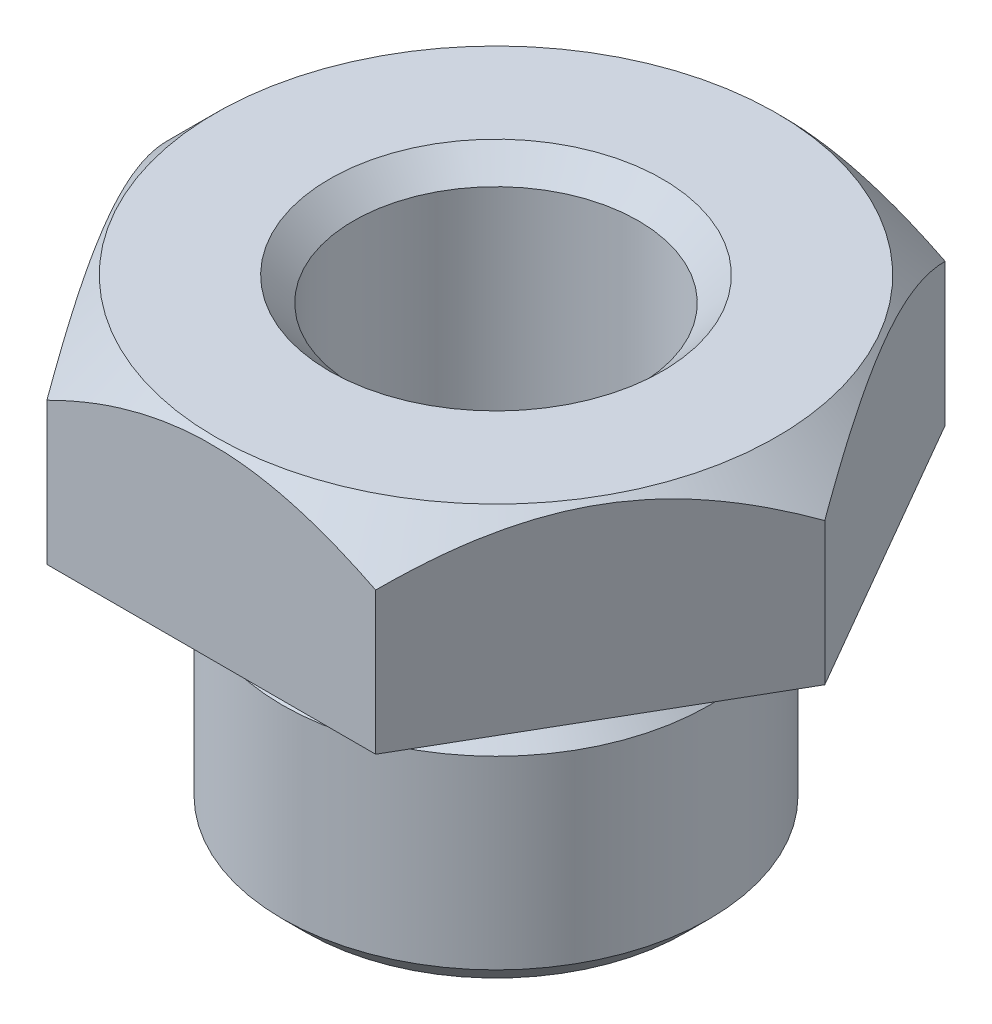
ISO-10303-21;
HEADER;
FILE_DESCRIPTION(('STEP AP214'),'2;1');
FILE_NAME('part.step','',(''),(''),'','','');
FILE_SCHEMA(('AUTOMOTIVE_DESIGN { 1 0 10303 214 1 1 1 1 }'));
ENDSEC;
DATA;
#1=APPLICATION_CONTEXT('core data for automotive mechanical design processes');
#2=APPLICATION_PROTOCOL_DEFINITION('international standard','automotive_design',2000,#1);
#3=PRODUCT_CONTEXT('',#1,'mechanical');
#4=PRODUCT('Part','Part','',(#3));
#5=PRODUCT_RELATED_PRODUCT_CATEGORY('part','',(#4));
#6=PRODUCT_DEFINITION_FORMATION('','',#4);
#7=PRODUCT_DEFINITION_CONTEXT('part definition',#1,'design');
#8=PRODUCT_DEFINITION('design','',#6,#7);
#9=PRODUCT_DEFINITION_SHAPE('','',#8);
#10=(LENGTH_UNIT() NAMED_UNIT(*) SI_UNIT(.MILLI.,.METRE.));
#11=(NAMED_UNIT(*) PLANE_ANGLE_UNIT() SI_UNIT($,.RADIAN.));
#12=(NAMED_UNIT(*) SI_UNIT($,.STERADIAN.) SOLID_ANGLE_UNIT());
#13=UNCERTAINTY_MEASURE_WITH_UNIT(LENGTH_MEASURE(1.E-05),#10,'distance_accuracy_value','');
#14=(GEOMETRIC_REPRESENTATION_CONTEXT(3) GLOBAL_UNCERTAINTY_ASSIGNED_CONTEXT((#13)) GLOBAL_UNIT_ASSIGNED_CONTEXT((#10,
#11,#12)) REPRESENTATION_CONTEXT('',''));
#15=CARTESIAN_POINT('',(0.,0.,0.));
#16=DIRECTION('',(0.,0.,1.));
#17=DIRECTION('',(1.,0.,0.));
#18=AXIS2_PLACEMENT_3D('',#15,#16,#17);
#19=CARTESIAN_POINT('',(0.,0.4953,0.));
#20=DIRECTION('',(0.,-1.,0.));
#21=DIRECTION('',(0.,0.,-1.));
#22=AXIS2_PLACEMENT_3D('',#19,#20,#21);
#23=CYLINDRICAL_SURFACE('',#22,2.25);
#24=CARTESIAN_POINT('',(0.,-2.2479,0.));
#25=DIRECTION('',(0.,1.,0.));
#26=DIRECTION('',(0.,0.,1.));
#27=AXIS2_PLACEMENT_3D('',#24,#25,#26);
#28=CIRCLE('',#27,2.25);
#29=CARTESIAN_POINT('',(0.,-2.2479,2.25));
#30=VERTEX_POINT('',#29);
#31=EDGE_CURVE('E11',#30,#30,#28,.T.);
#32=ORIENTED_EDGE('',*,*,#31,.T.);
#33=EDGE_LOOP('',(#32));
#34=FACE_BOUND('',#33,.T.);
#35=CARTESIAN_POINT('',(0.,-0.29845,0.));
#36=DIRECTION('',(0.,1.,0.));
#37=DIRECTION('',(0.,0.,1.));
#38=AXIS2_PLACEMENT_3D('',#35,#36,#37);
#39=CIRCLE('',#38,2.25);
#40=CARTESIAN_POINT('',(0.,-0.29845,2.25));
#41=VERTEX_POINT('',#40);
#42=EDGE_CURVE('E252',#41,#41,#39,.T.);
#43=ORIENTED_EDGE('',*,*,#42,.F.);
#44=EDGE_LOOP('',(#43));
#45=FACE_BOUND('',#44,.T.);
#46=ADVANCED_FACE('F17',(#34,#45),#23,.T.);
#47=CARTESIAN_POINT('',(-1.73205080756888,2.5019,-3.));
#48=DIRECTION('',(0.866025403784439,0.,0.5));
#49=DIRECTION('',(0.5,0.,-0.866025403784439));
#50=AXIS2_PLACEMENT_3D('',#47,#48,#49);
#51=PLANE('',#50);
#52=CARTESIAN_POINT('',(-1.73193533751504,1.99378452417285,-3.0002));
#53=CARTESIAN_POINT('',(-1.79147372663452,2.05327168167821,-2.89707648504425));
#54=CARTESIAN_POINT('',(-1.85200767512883,2.10926502053448,-2.79222861066935));
#55=CARTESIAN_POINT('',(-1.97544301635334,2.21178740362106,-2.57843232821891));
#56=CARTESIAN_POINT('',(-2.03835614749388,2.25825940625871,-2.46946358862024));
#57=CARTESIAN_POINT('',(-2.16521745390422,2.3378668114837,-2.24973336040297));
#58=CARTESIAN_POINT('',(-2.22913332270057,2.37120229935733,-2.13902782823779));
#59=CARTESIAN_POINT('',(-2.35837216363117,2.4225624560207,-1.91517958943468));
#60=CARTESIAN_POINT('',(-2.42369118784644,2.4406254624644,-1.80204372079301));
#61=CARTESIAN_POINT('',(-2.53626564359199,2.4569230915495,-1.6070590438073));
#62=CARTESIAN_POINT('',(-2.58337569224233,2.45933563282619,-1.52546204599787));
#63=CARTESIAN_POINT('',(-2.67751916315865,2.45527056534289,-1.36240077116991));
#64=CARTESIAN_POINT('',(-2.72455255277569,2.4487898399717,-1.28093655070102));
#65=CARTESIAN_POINT('',(-2.81817374583237,2.42730827748478,-1.11877988766164));
#66=CARTESIAN_POINT('',(-2.86476099147974,2.41229791003272,-1.0380884112157));
#67=CARTESIAN_POINT('',(-2.95713536549224,2.37457635393399,-0.878091302108671));
#68=CARTESIAN_POINT('',(-3.00292255491614,2.35186575567717,-0.798785563690711));
#69=CARTESIAN_POINT('',(-3.0842086834051,2.30513931514606,-0.657993859197254));
#70=CARTESIAN_POINT('',(-3.11988753362891,2.28235167231921,-0.596196277853981));
#71=CARTESIAN_POINT('',(-3.19060468282508,2.23310371394256,-0.473710582479786));
#72=CARTESIAN_POINT('',(-3.22564296221629,2.20664328633381,-0.413022502364402));
#73=CARTESIAN_POINT('',(-3.29496858432307,2.15064300560864,-0.292947002609142));
#74=CARTESIAN_POINT('',(-3.3292578988429,2.12111283552163,-0.233556167704086));
#75=CARTESIAN_POINT('',(-3.39720147685868,2.05936090842448,-0.115874438532735));
#76=CARTESIAN_POINT('',(-3.43085611477446,2.02714080334065,-0.0575828957522686));
#77=CARTESIAN_POINT('',(-3.46421708519159,1.99378452417285,0.000199999999997666));
#78=B_SPLINE_CURVE_WITH_KNOTS('',3,(#52,#53,#54,#55,#56,#57,#58,#59,#60,#61,#62,#63,#64,#65,#66,
#67,#68,#69,#70,#71,#72,#73,#74,#75,#76,#77),.UNSPECIFIED.,.F.,.F.,(4,2,2,2,2,2,2,2,2,2,2,2,4),
(0.,0.399603557139305,0.801535286397844,1.19708369162343,1.59163620080173,1.87398941755844,
2.15644160919092,2.43921001247425,2.72195674032137,2.94657516661926,3.17120044767274,
3.3951375283781,3.61893808380739),.UNSPECIFIED.);
#79=CARTESIAN_POINT('',(-1.73205080756888,1.9939,-3.));
#80=VERTEX_POINT('',#79);
#81=CARTESIAN_POINT('',(-3.46410161513776,1.9939,0.));
#82=VERTEX_POINT('',#81);
#83=EDGE_CURVE('E208',#80,#82,#78,.T.);
#84=ORIENTED_EDGE('',*,*,#83,.F.);
#85=DIRECTION('',(0.,-1.,0.));
#86=VECTOR('',#85,1.);
#87=CARTESIAN_POINT('',(-1.73205080756888,2.5019,-3.));
#88=LINE('',#87,#86);
#89=CARTESIAN_POINT('',(-1.73205080756888,0.4953,-3.));
#90=VERTEX_POINT('',#89);
#91=EDGE_CURVE('E40',#80,#90,#88,.T.);
#92=ORIENTED_EDGE('',*,*,#91,.T.);
#93=DIRECTION('',(0.5,0.,-0.866025403784439));
#94=VECTOR('',#93,1.);
#95=CARTESIAN_POINT('',(-1.73205080756888,0.4953,-3.));
#96=LINE('',#95,#94);
#97=CARTESIAN_POINT('',(-3.46410161513775,0.4953,0.));
#98=VERTEX_POINT('',#97);
#99=EDGE_CURVE('E233',#98,#90,#96,.T.);
#100=ORIENTED_EDGE('',*,*,#99,.F.);
#101=DIRECTION('',(0.,-1.,0.));
#102=VECTOR('',#101,1.);
#103=CARTESIAN_POINT('',(-3.46410161513775,2.5019,0.));
#104=LINE('',#103,#102);
#105=EDGE_CURVE('E94',#82,#98,#104,.T.);
#106=ORIENTED_EDGE('',*,*,#105,.F.);
#107=EDGE_LOOP('',(#84,#92,#100,#106));
#108=FACE_BOUND('',#107,.T.);
#109=ADVANCED_FACE('F143',(#108),#51,.F.);
#110=CARTESIAN_POINT('',(-3.46410161513775,2.5019,0.));
#111=DIRECTION('',(0.866025403784439,0.,-0.5));
#112=DIRECTION('',(-0.5,0.,-0.866025403784439));
#113=AXIS2_PLACEMENT_3D('',#110,#111,#112);
#114=PLANE('',#113);
#115=CARTESIAN_POINT('',(-3.46421708519159,1.99378452417285,-0.000200000000002596));
#116=CARTESIAN_POINT('',(-3.40467869607211,2.05327168167822,0.102923514955745));
#117=CARTESIAN_POINT('',(-3.3441447475778,2.10926502053448,0.207771389330647));
#118=CARTESIAN_POINT('',(-3.2207094063533,2.21178740362106,0.421567671781092));
#119=CARTESIAN_POINT('',(-3.15779627521275,2.25825940625871,0.530536411379756));
#120=CARTESIAN_POINT('',(-3.03093496880242,2.3378668114837,0.750266639597024));
#121=CARTESIAN_POINT('',(-2.96701910000607,2.37120229935733,0.860972171762207));
#122=CARTESIAN_POINT('',(-2.83778025907547,2.4225624560207,1.08482041056532));
#123=CARTESIAN_POINT('',(-2.7724612348602,2.4406254624644,1.19795627920699));
#124=CARTESIAN_POINT('',(-2.65988677911465,2.45692309154951,1.3929409561927));
#125=CARTESIAN_POINT('',(-2.6127767304643,2.4593356328262,1.47453795400213));
#126=CARTESIAN_POINT('',(-2.51863325954798,2.45527056534289,1.63759922883008));
#127=CARTESIAN_POINT('',(-2.47159986993094,2.4487898399717,1.71906344929898));
#128=CARTESIAN_POINT('',(-2.37797867687426,2.42730827748478,1.88122011233836));
#129=CARTESIAN_POINT('',(-2.3313914312269,2.41229791003273,1.96191158878429));
#130=CARTESIAN_POINT('',(-2.23901705721439,2.37457635393399,2.12190869789133));
#131=CARTESIAN_POINT('',(-2.1932298677905,2.35186575567717,2.20121443630929));
#132=CARTESIAN_POINT('',(-2.11194373930153,2.30513931514606,2.34200614080275));
#133=CARTESIAN_POINT('',(-2.07626488907773,2.28235167231921,2.40380372214602));
#134=CARTESIAN_POINT('',(-2.00554773988156,2.23310371394256,2.52628941752021));
#135=CARTESIAN_POINT('',(-1.97050946049034,2.20664328633381,2.5869774976356));
#136=CARTESIAN_POINT('',(-1.90118383838356,2.15064300560864,2.70705299739086));
#137=CARTESIAN_POINT('',(-1.86689452386373,2.12111283552163,2.76644383229592));
#138=CARTESIAN_POINT('',(-1.79895094584795,2.05936090842448,2.88412556146727));
#139=CARTESIAN_POINT('',(-1.76529630793217,2.02714080334065,2.94241710424773));
#140=CARTESIAN_POINT('',(-1.73193533751504,1.99378452417285,3.0002));
#141=B_SPLINE_CURVE_WITH_KNOTS('',3,(#115,#116,#117,#118,#119,#120,#121,#122,#123,#124,#125,
#126,#127,#128,#129,#130,#131,#132,#133,#134,#135,#136,#137,#138,#139,#140),.UNSPECIFIED.,.F.,
.F.,(4,2,2,2,2,2,2,2,2,2,2,2,4),(0.,0.399603557139306,0.801535286397844,1.19708369162343,
1.59163620080173,1.87398941755844,2.15644160919092,2.43921001247424,2.72195674032137,
2.94657516661926,3.17120044767274,3.3951375283781,3.61893808380739),.UNSPECIFIED.);
#142=CARTESIAN_POINT('',(-1.73205080756888,1.9939,3.));
#143=VERTEX_POINT('',#142);
#144=EDGE_CURVE('E75',#82,#143,#141,.T.);
#145=ORIENTED_EDGE('',*,*,#144,.F.);
#146=ORIENTED_EDGE('',*,*,#105,.T.);
#147=DIRECTION('',(-0.5,0.,-0.866025403784439));
#148=VECTOR('',#147,1.);
#149=CARTESIAN_POINT('',(-3.46410161513775,0.4953,0.));
#150=LINE('',#149,#148);
#151=CARTESIAN_POINT('',(-1.73205080756888,0.4953,3.));
#152=VERTEX_POINT('',#151);
#153=EDGE_CURVE('E237',#152,#98,#150,.T.);
#154=ORIENTED_EDGE('',*,*,#153,.F.);
#155=DIRECTION('',(0.,-1.,0.));
#156=VECTOR('',#155,1.);
#157=CARTESIAN_POINT('',(-1.73205080756888,2.5019,3.));
#158=LINE('',#157,#156);
#159=EDGE_CURVE('E92',#143,#152,#158,.T.);
#160=ORIENTED_EDGE('',*,*,#159,.F.);
#161=EDGE_LOOP('',(#145,#146,#154,#160));
#162=FACE_BOUND('',#161,.T.);
#163=ADVANCED_FACE('F148',(#162),#114,.F.);
#164=CARTESIAN_POINT('',(-1.73205080756888,2.5019,3.));
#165=DIRECTION('',(0.,0.,-1.));
#166=DIRECTION('',(-1.,0.,0.));
#167=AXIS2_PLACEMENT_3D('',#164,#165,#166);
#168=PLANE('',#167);
#169=CARTESIAN_POINT('',(-3.59695086276358,0.774193814946156,3.));
#170=CARTESIAN_POINT('',(-3.50998157030183,0.84096724693537,3.));
#171=CARTESIAN_POINT('',(-3.42254166577498,0.907137397886244,3.));
#172=CARTESIAN_POINT('',(-3.24652900024599,1.03799611293745,3.));
#173=CARTESIAN_POINT('',(-3.15795597444398,1.10268432048757,3.));
#174=CARTESIAN_POINT('',(-2.97883797786402,1.2307645173772,3.));
#175=CARTESIAN_POINT('',(-2.88828306265059,1.29414264524063,3.));
#176=CARTESIAN_POINT('',(-2.70566270010348,1.41867649616719,3.));
#177=CARTESIAN_POINT('',(-2.61359735768501,1.47983237264857,3.));
#178=CARTESIAN_POINT('',(-2.4218744779485,1.60316656395522,3.));
#179=CARTESIAN_POINT('',(-2.32210289356472,1.6651684834916,3.));
#180=CARTESIAN_POINT('',(-2.12021794189516,1.78529964178567,3.));
#181=CARTESIAN_POINT('',(-2.01810418683339,1.84342823295221,3.));
#182=CARTESIAN_POINT('',(-1.81151102958675,1.95457298531259,3.));
#183=CARTESIAN_POINT('',(-1.70703976758902,2.00760415894041,3.));
#184=CARTESIAN_POINT('',(-1.49515494056828,2.10736599217492,3.));
#185=CARTESIAN_POINT('',(-1.38774278636662,2.15409961130161,3.));
#186=CARTESIAN_POINT('',(-1.18029844183721,2.23543902777672,3.));
#187=CARTESIAN_POINT('',(-1.08055778348695,2.27078076314877,3.));
#188=CARTESIAN_POINT('',(-0.878550486228742,2.33347903086965,3.));
#189=CARTESIAN_POINT('',(-0.776283685576635,2.36083505046315,3.));
#190=CARTESIAN_POINT('',(-0.571606980836931,2.40563119534322,3.));
#191=CARTESIAN_POINT('',(-0.469236911942401,2.42325028248963,3.));
#192=CARTESIAN_POINT('',(-0.263244203517824,2.44820759032046,3.));
#193=CARTESIAN_POINT('',(-0.15962182297908,2.45554790127102,3.));
#194=CARTESIAN_POINT('',(0.0433812195169501,2.4593310610849,3.));
#195=CARTESIAN_POINT('',(0.142753528363383,2.45622705036072,3.));
#196=CARTESIAN_POINT('',(0.340714729188156,2.44032923231905,3.));
#197=CARTESIAN_POINT('',(0.43930354858696,2.42753453762644,3.));
#198=CARTESIAN_POINT('',(0.63665451402324,2.3927585299711,3.));
#199=CARTESIAN_POINT('',(0.735387711161854,2.37061567804338,3.));
#200=CARTESIAN_POINT('',(0.930682625702606,2.31836656603362,3.));
#201=CARTESIAN_POINT('',(1.02724447266259,2.28826078245073,3.));
#202=CARTESIAN_POINT('',(1.22387216951796,2.21934988533483,3.));
#203=CARTESIAN_POINT('',(1.32378887914214,2.18012397987145,3.));
#204=CARTESIAN_POINT('',(1.52103691716468,2.09562068557772,3.));
#205=CARTESIAN_POINT('',(1.61836740024578,2.05034134663154,3.));
#206=CARTESIAN_POINT('',(1.81092506081258,1.95479748704498,3.));
#207=CARTESIAN_POINT('',(1.9061443624688,1.90451722220017,3.));
#208=CARTESIAN_POINT('',(2.09439813797167,1.80008251800508,3.));
#209=CARTESIAN_POINT('',(2.18743299314642,1.74592876161099,3.));
#210=CARTESIAN_POINT('',(2.36705693920382,1.63725526172232,3.));
#211=CARTESIAN_POINT('',(2.45373740927194,1.58288575896158,3.));
#212=CARTESIAN_POINT('',(2.62560919961733,1.47183500771075,3.));
#213=CARTESIAN_POINT('',(2.71080040743645,1.41515358570953,3.));
#214=CARTESIAN_POINT('',(2.87920299479885,1.3003534459034,3.));
#215=CARTESIAN_POINT('',(2.96242478412024,1.24224994352595,3.));
#216=CARTESIAN_POINT('',(3.12772705302553,1.12448727297542,3.));
#217=CARTESIAN_POINT('',(3.20980784085829,1.06482853799342,3.));
#218=CARTESIAN_POINT('',(3.29141007297566,1.00453327366662,3.));
#219=B_SPLINE_CURVE_WITH_KNOTS('',3,(#169,#170,#171,#172,#173,#174,#175,#176,#177,#178,#179,
#180,#181,#182,#183,#184,#185,#186,#187,#188,#189,#190,#191,#192,#193,#194,#195,#196,#197,#198,
#199,#200,#201,#202,#203,#204,#205,#206,#207,#208,#209,#210,#211,#212,#213,#214,#215,#216,#217,
#218),.UNSPECIFIED.,.F.,.F.,(4,2,2,2,2,2,2,2,2,2,2,2,2,2,2,2,2,2,2,2,2,2,2,2,4),(0.,
0.328945504657775,0.657969338433108,0.989533144140025,1.32107401591719,1.67340652475152,
2.02579779386726,2.37711721238604,2.72827094911288,3.04544780343796,3.36264501891408,
3.67379992622852,3.98489154866773,4.28266313877366,4.58046199909647,4.88363234184904,
5.18678454709309,5.5085594303902,5.8304382245001,6.15336454013356,6.47623405857336,
6.7831534664014,7.09009595127913,7.39457119474018,7.69896251786104),.UNSPECIFIED.);
#220=CARTESIAN_POINT('',(1.73205080756887,1.9939,3.));
#221=VERTEX_POINT('',#220);
#222=EDGE_CURVE('E70',#143,#221,#219,.T.);
#223=ORIENTED_EDGE('',*,*,#222,.F.);
#224=ORIENTED_EDGE('',*,*,#159,.T.);
#225=DIRECTION('',(-1.,0.,0.));
#226=VECTOR('',#225,1.);
#227=CARTESIAN_POINT('',(-1.73205080756888,0.4953,3.));
#228=LINE('',#227,#226);
#229=CARTESIAN_POINT('',(1.73205080756888,0.4953,3.));
#230=VERTEX_POINT('',#229);
#231=EDGE_CURVE('E91',#230,#152,#228,.T.);
#232=ORIENTED_EDGE('',*,*,#231,.F.);
#233=DIRECTION('',(0.,-1.,0.));
#234=VECTOR('',#233,1.);
#235=CARTESIAN_POINT('',(1.73205080756888,2.5019,3.));
#236=LINE('',#235,#234);
#237=EDGE_CURVE('E84',#221,#230,#236,.T.);
#238=ORIENTED_EDGE('',*,*,#237,.F.);
#239=EDGE_LOOP('',(#223,#224,#232,#238));
#240=FACE_BOUND('',#239,.T.);
#241=ADVANCED_FACE('F89',(#240),#168,.F.);
#242=CARTESIAN_POINT('',(1.73205080756888,2.5019,3.));
#243=DIRECTION('',(-0.866025403784439,0.,-0.5));
#244=DIRECTION('',(-0.5,0.,0.866025403784439));
#245=AXIS2_PLACEMENT_3D('',#242,#243,#244);
#246=PLANE('',#245);
#247=CARTESIAN_POINT('',(1.73193533751504,1.99378452417285,3.0002));
#248=CARTESIAN_POINT('',(1.79147372663452,2.05327168167822,2.89707648504425));
#249=CARTESIAN_POINT('',(1.85200767512883,2.10926502053448,2.79222861066935));
#250=CARTESIAN_POINT('',(1.97544301635334,2.21178740362106,2.5784323282189));
#251=CARTESIAN_POINT('',(2.03835614749388,2.25825940625871,2.46946358862024));
#252=CARTESIAN_POINT('',(2.16521745390422,2.33786681148371,2.24973336040297));
#253=CARTESIAN_POINT('',(2.22913332270057,2.37120229935734,2.13902782823779));
#254=CARTESIAN_POINT('',(2.35837216363117,2.4225624560207,1.91517958943468));
#255=CARTESIAN_POINT('',(2.42369118784644,2.4406254624644,1.80204372079301));
#256=CARTESIAN_POINT('',(2.53626564359199,2.45692309154951,1.6070590438073));
#257=CARTESIAN_POINT('',(2.58337569224233,2.4593356328262,1.52546204599787));
#258=CARTESIAN_POINT('',(2.67751916315865,2.45527056534289,1.36240077116991));
#259=CARTESIAN_POINT('',(2.72455255277569,2.4487898399717,1.28093655070101));
#260=CARTESIAN_POINT('',(2.81817374583237,2.42730827748478,1.11877988766163));
#261=CARTESIAN_POINT('',(2.86476099147974,2.41229791003273,1.0380884112157));
#262=CARTESIAN_POINT('',(2.95713536549224,2.37457635393399,0.878091302108669));
#263=CARTESIAN_POINT('',(3.00292255491614,2.35186575567717,0.798785563690709));
#264=CARTESIAN_POINT('',(3.0842086834051,2.30513931514606,0.657993859197251));
#265=CARTESIAN_POINT('',(3.11988753362891,2.28235167231921,0.596196277853978));
#266=CARTESIAN_POINT('',(3.19060468282508,2.23310371394256,0.473710582479782));
#267=CARTESIAN_POINT('',(3.22564296221629,2.20664328633381,0.413022502364398));
#268=CARTESIAN_POINT('',(3.29496858432307,2.15064300560864,0.292947002609136));
#269=CARTESIAN_POINT('',(3.3292578988429,2.12111283552163,0.23355616770408));
#270=CARTESIAN_POINT('',(3.39720147685869,2.05936090842447,0.115874438532728));
#271=CARTESIAN_POINT('',(3.43085611477447,2.02714080334065,0.0575828957522614));
#272=CARTESIAN_POINT('',(3.46421708519159,1.99378452417285,-0.000200000000005086));
#273=B_SPLINE_CURVE_WITH_KNOTS('',3,(#247,#248,#249,#250,#251,#252,#253,#254,#255,#256,#257,
#258,#259,#260,#261,#262,#263,#264,#265,#266,#267,#268,#269,#270,#271,#272),.UNSPECIFIED.,.F.,
.F.,(4,2,2,2,2,2,2,2,2,2,2,2,4),(0.,0.399603557139306,0.801535286397844,1.19708369162343,
1.59163620080173,1.87398941755844,2.15644160919092,2.43921001247424,2.72195674032137,
2.94657516661926,3.17120044767274,3.3951375283781,3.61893808380739),.UNSPECIFIED.);
#274=CARTESIAN_POINT('',(3.46410161513776,1.9939,0.));
#275=VERTEX_POINT('',#274);
#276=EDGE_CURVE('E73',#221,#275,#273,.T.);
#277=ORIENTED_EDGE('',*,*,#276,.F.);
#278=ORIENTED_EDGE('',*,*,#237,.T.);
#279=DIRECTION('',(-0.5,0.,0.866025403784439));
#280=VECTOR('',#279,1.);
#281=CARTESIAN_POINT('',(1.73205080756888,0.4953,3.));
#282=LINE('',#281,#280);
#283=CARTESIAN_POINT('',(3.46410161513776,0.4953,0.));
#284=VERTEX_POINT('',#283);
#285=EDGE_CURVE('E241',#284,#230,#282,.T.);
#286=ORIENTED_EDGE('',*,*,#285,.F.);
#287=DIRECTION('',(0.,-1.,0.));
#288=VECTOR('',#287,1.);
#289=CARTESIAN_POINT('',(3.46410161513776,2.5019,0.));
#290=LINE('',#289,#288);
#291=EDGE_CURVE('E86',#275,#284,#290,.T.);
#292=ORIENTED_EDGE('',*,*,#291,.F.);
#293=EDGE_LOOP('',(#277,#278,#286,#292));
#294=FACE_BOUND('',#293,.T.);
#295=ADVANCED_FACE('F82',(#294),#246,.F.);
#296=CARTESIAN_POINT('',(3.46410161513776,2.5019,0.));
#297=DIRECTION('',(-0.866025403784439,0.,0.5));
#298=DIRECTION('',(0.5,0.,0.866025403784439));
#299=AXIS2_PLACEMENT_3D('',#296,#297,#298);
#300=PLANE('',#299);
#301=CARTESIAN_POINT('',(3.46421708519159,1.99378452417285,0.000199999999995162));
#302=CARTESIAN_POINT('',(3.40467869607211,2.05327168167821,-0.102923514955752));
#303=CARTESIAN_POINT('',(3.3441447475778,2.10926502053448,-0.207771389330654));
#304=CARTESIAN_POINT('',(3.2207094063533,2.21178740362106,-0.421567671781099));
#305=CARTESIAN_POINT('',(3.15779627521276,2.25825940625871,-0.530536411379762));
#306=CARTESIAN_POINT('',(3.03093496880242,2.3378668114837,-0.750266639597029));
#307=CARTESIAN_POINT('',(2.96701910000607,2.37120229935733,-0.860972171762212));
#308=CARTESIAN_POINT('',(2.83778025907547,2.42256245602069,-1.08482041056532));
#309=CARTESIAN_POINT('',(2.7724612348602,2.4406254624644,-1.19795627920699));
#310=CARTESIAN_POINT('',(2.65988677911465,2.4569230915495,-1.3929409561927));
#311=CARTESIAN_POINT('',(2.61277673046431,2.45933563282619,-1.47453795400213));
#312=CARTESIAN_POINT('',(2.51863325954798,2.45527056534289,-1.63759922883009));
#313=CARTESIAN_POINT('',(2.47159986993094,2.44878983997169,-1.71906344929899));
#314=CARTESIAN_POINT('',(2.37797867687427,2.42730827748478,-1.88122011233837));
#315=CARTESIAN_POINT('',(2.3313914312269,2.41229791003272,-1.9619115887843));
#316=CARTESIAN_POINT('',(2.23901705721439,2.37457635393399,-2.12190869789133));
#317=CARTESIAN_POINT('',(2.1932298677905,2.35186575567717,-2.20121443630929));
#318=CARTESIAN_POINT('',(2.11194373930154,2.30513931514606,-2.34200614080275));
#319=CARTESIAN_POINT('',(2.07626488907773,2.2823516723192,-2.40380372214602));
#320=CARTESIAN_POINT('',(2.00554773988156,2.23310371394255,-2.52628941752022));
#321=CARTESIAN_POINT('',(1.97050946049034,2.2066432863338,-2.5869774976356));
#322=CARTESIAN_POINT('',(1.90118383838356,2.15064300560864,-2.70705299739086));
#323=CARTESIAN_POINT('',(1.86689452386373,2.12111283552163,-2.76644383229592));
#324=CARTESIAN_POINT('',(1.79895094584795,2.05936090842447,-2.88412556146727));
#325=CARTESIAN_POINT('',(1.76529630793217,2.02714080334064,-2.94241710424774));
#326=CARTESIAN_POINT('',(1.73193533751504,1.99378452417285,-3.0002));
#327=B_SPLINE_CURVE_WITH_KNOTS('',3,(#301,#302,#303,#304,#305,#306,#307,#308,#309,#310,#311,
#312,#313,#314,#315,#316,#317,#318,#319,#320,#321,#322,#323,#324,#325,#326),.UNSPECIFIED.,.F.,
.F.,(4,2,2,2,2,2,2,2,2,2,2,2,4),(0.,0.399603557139304,0.801535286397841,1.19708369162342,
1.59163620080172,1.87398941755843,2.15644160919092,2.43921001247424,2.72195674032137,
2.94657516661926,3.17120044767274,3.39513752837809,3.61893808380739),.UNSPECIFIED.);
#328=CARTESIAN_POINT('',(1.73205080756888,1.9939,-3.));
#329=VERTEX_POINT('',#328);
#330=EDGE_CURVE('E32',#275,#329,#327,.T.);
#331=ORIENTED_EDGE('',*,*,#330,.F.);
#332=ORIENTED_EDGE('',*,*,#291,.T.);
#333=DIRECTION('',(0.5,0.,0.866025403784439));
#334=VECTOR('',#333,1.);
#335=CARTESIAN_POINT('',(3.46410161513776,0.4953,0.));
#336=LINE('',#335,#334);
#337=CARTESIAN_POINT('',(1.73205080756888,0.4953,-3.));
#338=VERTEX_POINT('',#337);
#339=EDGE_CURVE('E231',#338,#284,#336,.T.);
#340=ORIENTED_EDGE('',*,*,#339,.F.);
#341=DIRECTION('',(0.,-1.,0.));
#342=VECTOR('',#341,1.);
#343=CARTESIAN_POINT('',(1.73205080756888,2.5019,-3.));
#344=LINE('',#343,#342);
#345=EDGE_CURVE('E96',#329,#338,#344,.T.);
#346=ORIENTED_EDGE('',*,*,#345,.F.);
#347=EDGE_LOOP('',(#331,#332,#340,#346));
#348=FACE_BOUND('',#347,.T.);
#349=ADVANCED_FACE('F163',(#348),#300,.F.);
#350=CARTESIAN_POINT('',(1.73205080756888,2.5019,-3.));
#351=DIRECTION('',(0.,0.,1.));
#352=DIRECTION('',(1.,0.,0.));
#353=AXIS2_PLACEMENT_3D('',#350,#351,#352);
#354=PLANE('',#353);
#355=CARTESIAN_POINT('',(-3.59695086276358,0.774193814946159,-3.));
#356=CARTESIAN_POINT('',(-3.50998157030183,0.840967246935372,-3.));
#357=CARTESIAN_POINT('',(-3.42254166577497,0.907137397886247,-3.));
#358=CARTESIAN_POINT('',(-3.24652900024599,1.03799611293745,-3.));
#359=CARTESIAN_POINT('',(-3.15795597444398,1.10268432048757,-3.));
#360=CARTESIAN_POINT('',(-2.97883797786401,1.2307645173772,-3.));
#361=CARTESIAN_POINT('',(-2.88828306265059,1.29414264524063,-3.));
#362=CARTESIAN_POINT('',(-2.70566270010348,1.41867649616719,-3.));
#363=CARTESIAN_POINT('',(-2.61359735768501,1.47983237264857,-3.));
#364=CARTESIAN_POINT('',(-2.42187447794849,1.60316656395522,-3.));
#365=CARTESIAN_POINT('',(-2.32210289356472,1.6651684834916,-3.));
#366=CARTESIAN_POINT('',(-2.12021794189516,1.78529964178567,-3.));
#367=CARTESIAN_POINT('',(-2.01810418683338,1.84342823295221,-3.));
#368=CARTESIAN_POINT('',(-1.81151102958675,1.95457298531259,-3.));
#369=CARTESIAN_POINT('',(-1.70703976758902,2.0076041589404,-3.));
#370=CARTESIAN_POINT('',(-1.49515494056828,2.10736599217491,-3.));
#371=CARTESIAN_POINT('',(-1.38774278636662,2.1540996113016,-3.));
#372=CARTESIAN_POINT('',(-1.18029844183721,2.23543902777671,-3.));
#373=CARTESIAN_POINT('',(-1.08055778348695,2.27078076314877,-3.));
#374=CARTESIAN_POINT('',(-0.878550486228741,2.33347903086965,-3.));
#375=CARTESIAN_POINT('',(-0.776283685576634,2.36083505046315,-3.));
#376=CARTESIAN_POINT('',(-0.57160698083693,2.40563119534321,-3.));
#377=CARTESIAN_POINT('',(-0.4692369119424,2.42325028248963,-3.));
#378=CARTESIAN_POINT('',(-0.263244203517823,2.44820759032045,-3.));
#379=CARTESIAN_POINT('',(-0.159621822979079,2.45554790127102,-3.));
#380=CARTESIAN_POINT('',(0.0433812195169506,2.4593310610849,-3.));
#381=CARTESIAN_POINT('',(0.142753528363383,2.45622705036072,-3.));
#382=CARTESIAN_POINT('',(0.340714729188156,2.44032923231905,-3.));
#383=CARTESIAN_POINT('',(0.43930354858696,2.42753453762643,-3.));
#384=CARTESIAN_POINT('',(0.63665451402324,2.39275852997109,-3.));
#385=CARTESIAN_POINT('',(0.735387711161854,2.37061567804338,-3.));
#386=CARTESIAN_POINT('',(0.930682625702607,2.31836656603362,-3.));
#387=CARTESIAN_POINT('',(1.02724447266259,2.28826078245073,-3.));
#388=CARTESIAN_POINT('',(1.22387216951796,2.21934988533482,-3.));
#389=CARTESIAN_POINT('',(1.32378887914214,2.18012397987144,-3.));
#390=CARTESIAN_POINT('',(1.52103691716468,2.09562068557772,-3.));
#391=CARTESIAN_POINT('',(1.61836740024578,2.05034134663154,-3.));
#392=CARTESIAN_POINT('',(1.81092506081258,1.95479748704497,-3.));
#393=CARTESIAN_POINT('',(1.9061443624688,1.90451722220016,-3.));
#394=CARTESIAN_POINT('',(2.09439813797167,1.80008251800508,-3.));
#395=CARTESIAN_POINT('',(2.18743299314642,1.74592876161098,-3.));
#396=CARTESIAN_POINT('',(2.36705693920382,1.63725526172231,-3.));
#397=CARTESIAN_POINT('',(2.45373740927194,1.58288575896157,-3.));
#398=CARTESIAN_POINT('',(2.62560919961733,1.47183500771074,-3.));
#399=CARTESIAN_POINT('',(2.71080040743645,1.41515358570952,-3.));
#400=CARTESIAN_POINT('',(2.87920299479885,1.30035344590339,-3.));
#401=CARTESIAN_POINT('',(2.96242478412025,1.24224994352595,-3.));
#402=CARTESIAN_POINT('',(3.12772705302553,1.12448727297542,-3.));
#403=CARTESIAN_POINT('',(3.20980784085829,1.06482853799342,-3.));
#404=CARTESIAN_POINT('',(3.29141007297566,1.00453327366662,-3.));
#405=B_SPLINE_CURVE_WITH_KNOTS('',3,(#355,#356,#357,#358,#359,#360,#361,#362,#363,#364,#365,
#366,#367,#368,#369,#370,#371,#372,#373,#374,#375,#376,#377,#378,#379,#380,#381,#382,#383,#384,
#385,#386,#387,#388,#389,#390,#391,#392,#393,#394,#395,#396,#397,#398,#399,#400,#401,#402,#403,
#404),.UNSPECIFIED.,.F.,.F.,(4,2,2,2,2,2,2,2,2,2,2,2,2,2,2,2,2,2,2,2,2,2,2,2,4),(0.,
0.328945504657776,0.657969338433108,0.989533144140024,1.32107401591719,1.67340652475152,
2.02579779386725,2.37711721238604,2.72827094911287,3.04544780343796,3.36264501891407,
3.67379992622851,3.98489154866772,4.28266313877365,4.58046199909647,4.88363234184904,
5.18678454709309,5.50855943039019,5.83043822450009,6.15336454013356,6.47623405857335,
6.78315346640139,7.09009595127912,7.39457119474017,7.69896251786104),.UNSPECIFIED.);
#406=EDGE_CURVE('E168',#329,#80,#405,.F.);
#407=ORIENTED_EDGE('',*,*,#406,.F.);
#408=ORIENTED_EDGE('',*,*,#345,.T.);
#409=DIRECTION('',(1.,0.,0.));
#410=VECTOR('',#409,1.);
#411=CARTESIAN_POINT('',(1.73205080756888,0.4953,-3.));
#412=LINE('',#411,#410);
#413=EDGE_CURVE('E101',#90,#338,#412,.T.);
#414=ORIENTED_EDGE('',*,*,#413,.F.);
#415=ORIENTED_EDGE('',*,*,#91,.F.);
#416=EDGE_LOOP('',(#407,#408,#414,#415));
#417=FACE_BOUND('',#416,.T.);
#418=ADVANCED_FACE('F157',(#417),#354,.F.);
#419=CARTESIAN_POINT('',(-5.19615242270663,2.5019,3.));
#420=DIRECTION('',(0.,1.,0.));
#421=DIRECTION('',(0.,0.,1.));
#422=AXIS2_PLACEMENT_3D('',#419,#420,#421);
#423=PLANE('',#422);
#424=CARTESIAN_POINT('',(0.,2.5019,0.));
#425=DIRECTION('',(0.,1.,0.));
#426=DIRECTION('',(0.,0.,1.));
#427=AXIS2_PLACEMENT_3D('',#424,#425,#426);
#428=CIRCLE('',#427,1.754);
#429=CARTESIAN_POINT('',(0.,2.5019,1.754));
#430=VERTEX_POINT('',#429);
#431=EDGE_CURVE('E104',#430,#430,#428,.F.);
#432=ORIENTED_EDGE('',*,*,#431,.T.);
#433=EDGE_LOOP('',(#432));
#434=FACE_BOUND('',#433,.T.);
#435=CARTESIAN_POINT('',(0.,2.5019,0.));
#436=DIRECTION('',(0.,1.,0.));
#437=DIRECTION('',(0.,0.,1.));
#438=AXIS2_PLACEMENT_3D('',#435,#436,#437);
#439=CIRCLE('',#438,2.95610161513776);
#440=CARTESIAN_POINT('',(0.,2.5019,2.95610161513776));
#441=VERTEX_POINT('',#440);
#442=EDGE_CURVE('E175',#441,#441,#439,.T.);
#443=ORIENTED_EDGE('',*,*,#442,.T.);
#444=EDGE_LOOP('',(#443));
#445=FACE_BOUND('',#444,.T.);
#446=ADVANCED_FACE('F154',(#434,#445),#423,.T.);
#447=CARTESIAN_POINT('',(0.,0.4953,0.));
#448=DIRECTION('',(0.,-1.,0.));
#449=DIRECTION('',(0.,0.,-1.));
#450=AXIS2_PLACEMENT_3D('',#447,#448,#449);
#451=PLANE('',#450);
#452=ORIENTED_EDGE('',*,*,#99,.T.);
#453=ORIENTED_EDGE('',*,*,#413,.T.);
#454=ORIENTED_EDGE('',*,*,#339,.T.);
#455=ORIENTED_EDGE('',*,*,#285,.T.);
#456=ORIENTED_EDGE('',*,*,#231,.T.);
#457=ORIENTED_EDGE('',*,*,#153,.T.);
#458=EDGE_LOOP('',(#452,#453,#454,#455,#456,#457));
#459=FACE_BOUND('',#458,.T.);
#460=CARTESIAN_POINT('',(0.,0.4953,0.));
#461=DIRECTION('',(0.,1.,0.));
#462=DIRECTION('',(0.,0.,1.));
#463=AXIS2_PLACEMENT_3D('',#460,#461,#462);
#464=CIRCLE('',#463,1.996);
#465=CARTESIAN_POINT('',(0.,0.4953,1.996));
#466=VERTEX_POINT('',#465);
#467=EDGE_CURVE('E247',#466,#466,#464,.T.);
#468=ORIENTED_EDGE('',*,*,#467,.T.);
#469=EDGE_LOOP('',(#468));
#470=FACE_BOUND('',#469,.T.);
#471=ADVANCED_FACE('F138',(#459,#470),#451,.T.);
#472=CARTESIAN_POINT('',(-5.19615242270663,-2.5019,3.));
#473=DIRECTION('',(0.,1.,0.));
#474=DIRECTION('',(0.,0.,1.));
#475=AXIS2_PLACEMENT_3D('',#472,#473,#474);
#476=PLANE('',#475);
#477=CARTESIAN_POINT('',(0.,-2.5019,0.));
#478=DIRECTION('',(0.,1.,0.));
#479=DIRECTION('',(0.,0.,1.));
#480=AXIS2_PLACEMENT_3D('',#477,#478,#479);
#481=CIRCLE('',#480,1.754);
#482=CARTESIAN_POINT('',(0.,-2.5019,1.754));
#483=VERTEX_POINT('',#482);
#484=EDGE_CURVE('E25',#483,#483,#481,.T.);
#485=ORIENTED_EDGE('',*,*,#484,.T.);
#486=EDGE_LOOP('',(#485));
#487=FACE_BOUND('',#486,.T.);
#488=CARTESIAN_POINT('',(0.,-2.5019,0.));
#489=DIRECTION('',(0.,1.,0.));
#490=DIRECTION('',(0.,0.,1.));
#491=AXIS2_PLACEMENT_3D('',#488,#489,#490);
#492=CIRCLE('',#491,1.996);
#493=CARTESIAN_POINT('',(0.,-2.5019,1.996));
#494=VERTEX_POINT('',#493);
#495=EDGE_CURVE('E113',#494,#494,#492,.F.);
#496=ORIENTED_EDGE('',*,*,#495,.T.);
#497=EDGE_LOOP('',(#496));
#498=FACE_BOUND('',#497,.T.);
#499=ADVANCED_FACE('F118',(#487,#498),#476,.F.);
#500=CARTESIAN_POINT('',(0.,2.5019,0.));
#501=DIRECTION('',(0.,-1.,0.));
#502=DIRECTION('',(0.,0.,-1.));
#503=AXIS2_PLACEMENT_3D('',#500,#501,#502);
#504=CYLINDRICAL_SURFACE('',#503,1.5);
#505=CARTESIAN_POINT('',(0.,2.2479,0.));
#506=DIRECTION('',(0.,1.,0.));
#507=DIRECTION('',(0.,0.,1.));
#508=AXIS2_PLACEMENT_3D('',#505,#506,#507);
#509=CIRCLE('',#508,1.5);
#510=CARTESIAN_POINT('',(0.,2.2479,1.5));
#511=VERTEX_POINT('',#510);
#512=EDGE_CURVE('E110',#511,#511,#509,.T.);
#513=ORIENTED_EDGE('',*,*,#512,.T.);
#514=EDGE_LOOP('',(#513));
#515=FACE_BOUND('',#514,.T.);
#516=CARTESIAN_POINT('',(0.,-2.2479,0.));
#517=DIRECTION('',(0.,1.,0.));
#518=DIRECTION('',(0.,0.,1.));
#519=AXIS2_PLACEMENT_3D('',#516,#517,#518);
#520=CIRCLE('',#519,1.5);
#521=CARTESIAN_POINT('',(0.,-2.2479,1.5));
#522=VERTEX_POINT('',#521);
#523=EDGE_CURVE('E107',#522,#522,#520,.F.);
#524=ORIENTED_EDGE('',*,*,#523,.T.);
#525=EDGE_LOOP('',(#524));
#526=FACE_BOUND('',#525,.T.);
#527=ADVANCED_FACE('F127',(#515,#526),#504,.F.);
#528=CARTESIAN_POINT('',(0.,2.5019,0.));
#529=DIRECTION('',(0.,1.,0.));
#530=DIRECTION('',(0.,0.,1.));
#531=AXIS2_PLACEMENT_3D('',#528,#529,#530);
#532=CONICAL_SURFACE('',#531,1.754,0.785398163397445);
#533=ORIENTED_EDGE('',*,*,#512,.F.);
#534=EDGE_LOOP('',(#533));
#535=FACE_BOUND('',#534,.T.);
#536=ORIENTED_EDGE('',*,*,#431,.F.);
#537=EDGE_LOOP('',(#536));
#538=FACE_BOUND('',#537,.T.);
#539=ADVANCED_FACE('F124',(#535,#538),#532,.F.);
#540=CARTESIAN_POINT('',(0.,-2.2479,0.));
#541=DIRECTION('',(0.,-1.,0.));
#542=DIRECTION('',(0.,0.,-1.));
#543=AXIS2_PLACEMENT_3D('',#540,#541,#542);
#544=CONICAL_SURFACE('',#543,1.5,0.785398163397451);
#545=ORIENTED_EDGE('',*,*,#484,.F.);
#546=EDGE_LOOP('',(#545));
#547=FACE_BOUND('',#546,.T.);
#548=ORIENTED_EDGE('',*,*,#523,.F.);
#549=EDGE_LOOP('',(#548));
#550=FACE_BOUND('',#549,.T.);
#551=ADVANCED_FACE('F121',(#547,#550),#544,.F.);
#552=CARTESIAN_POINT('',(0.,-2.5019,0.));
#553=DIRECTION('',(0.,1.,0.));
#554=DIRECTION('',(0.,0.,1.));
#555=AXIS2_PLACEMENT_3D('',#552,#553,#554);
#556=CONICAL_SURFACE('',#555,1.996,0.785398163397449);
#557=ORIENTED_EDGE('',*,*,#31,.F.);
#558=EDGE_LOOP('',(#557));
#559=FACE_BOUND('',#558,.T.);
#560=ORIENTED_EDGE('',*,*,#495,.F.);
#561=EDGE_LOOP('',(#560));
#562=FACE_BOUND('',#561,.T.);
#563=ADVANCED_FACE('F19',(#559,#562),#556,.T.);
#564=CARTESIAN_POINT('',(0.,2.5019,0.));
#565=DIRECTION('',(0.,-1.,0.));
#566=DIRECTION('',(0.,0.,-1.));
#567=AXIS2_PLACEMENT_3D('',#564,#565,#566);
#568=CONICAL_SURFACE('',#567,2.95610161513776,0.785398163397448);
#569=ORIENTED_EDGE('',*,*,#442,.F.);
#570=EDGE_LOOP('',(#569));
#571=FACE_BOUND('',#570,.T.);
#572=ORIENTED_EDGE('',*,*,#83,.T.);
#573=ORIENTED_EDGE('',*,*,#144,.T.);
#574=ORIENTED_EDGE('',*,*,#222,.T.);
#575=ORIENTED_EDGE('',*,*,#276,.T.);
#576=ORIENTED_EDGE('',*,*,#330,.T.);
#577=ORIENTED_EDGE('',*,*,#406,.T.);
#578=EDGE_LOOP('',(#572,#573,#574,#575,#576,#577));
#579=FACE_BOUND('',#578,.T.);
#580=ADVANCED_FACE('F72',(#571,#579),#568,.T.);
#581=CARTESIAN_POINT('',(0.,2.2479,0.));
#582=DIRECTION('',(0.,1.,0.));
#583=DIRECTION('',(0.,0.,1.));
#584=AXIS2_PLACEMENT_3D('',#581,#582,#583);
#585=CYLINDRICAL_SURFACE('',#584,1.996);
#586=CARTESIAN_POINT('',(0.,-0.0444500000000014,0.));
#587=DIRECTION('',(0.,1.,0.));
#588=DIRECTION('',(0.,0.,1.));
#589=AXIS2_PLACEMENT_3D('',#586,#587,#588);
#590=CIRCLE('',#589,1.996);
#591=CARTESIAN_POINT('',(0.,-0.0444500000000014,1.996));
#592=VERTEX_POINT('',#591);
#593=EDGE_CURVE('E249',#592,#592,#590,.T.);
#594=ORIENTED_EDGE('',*,*,#593,.T.);
#595=EDGE_LOOP('',(#594));
#596=FACE_BOUND('',#595,.T.);
#597=ORIENTED_EDGE('',*,*,#467,.F.);
#598=EDGE_LOOP('',(#597));
#599=FACE_BOUND('',#598,.T.);
#600=ADVANCED_FACE('F184',(#596,#599),#585,.T.);
#601=CARTESIAN_POINT('',(0.,-0.0444500000000014,0.));
#602=DIRECTION('',(0.,-1.,0.));
#603=DIRECTION('',(0.,0.,-1.));
#604=AXIS2_PLACEMENT_3D('',#601,#602,#603);
#605=CONICAL_SURFACE('',#604,1.996,0.785398163397451);
#606=ORIENTED_EDGE('',*,*,#42,.T.);
#607=EDGE_LOOP('',(#606));
#608=FACE_BOUND('',#607,.T.);
#609=ORIENTED_EDGE('',*,*,#593,.F.);
#610=EDGE_LOOP('',(#609));
#611=FACE_BOUND('',#610,.T.);
#612=ADVANCED_FACE('F258',(#608,#611),#605,.T.);
#613=CLOSED_SHELL('',(#46,#109,#163,#241,#295,#349,#418,#446,#471,#499,#527,#539,#551,#563,#580,
#600,#612));
#614=MANIFOLD_SOLID_BREP('B1',#613);
#615=ADVANCED_BREP_SHAPE_REPRESENTATION('',(#18,#614),#14);
#616=SHAPE_DEFINITION_REPRESENTATION(#9,#615);
ENDSEC;
END-ISO-10303-21;
